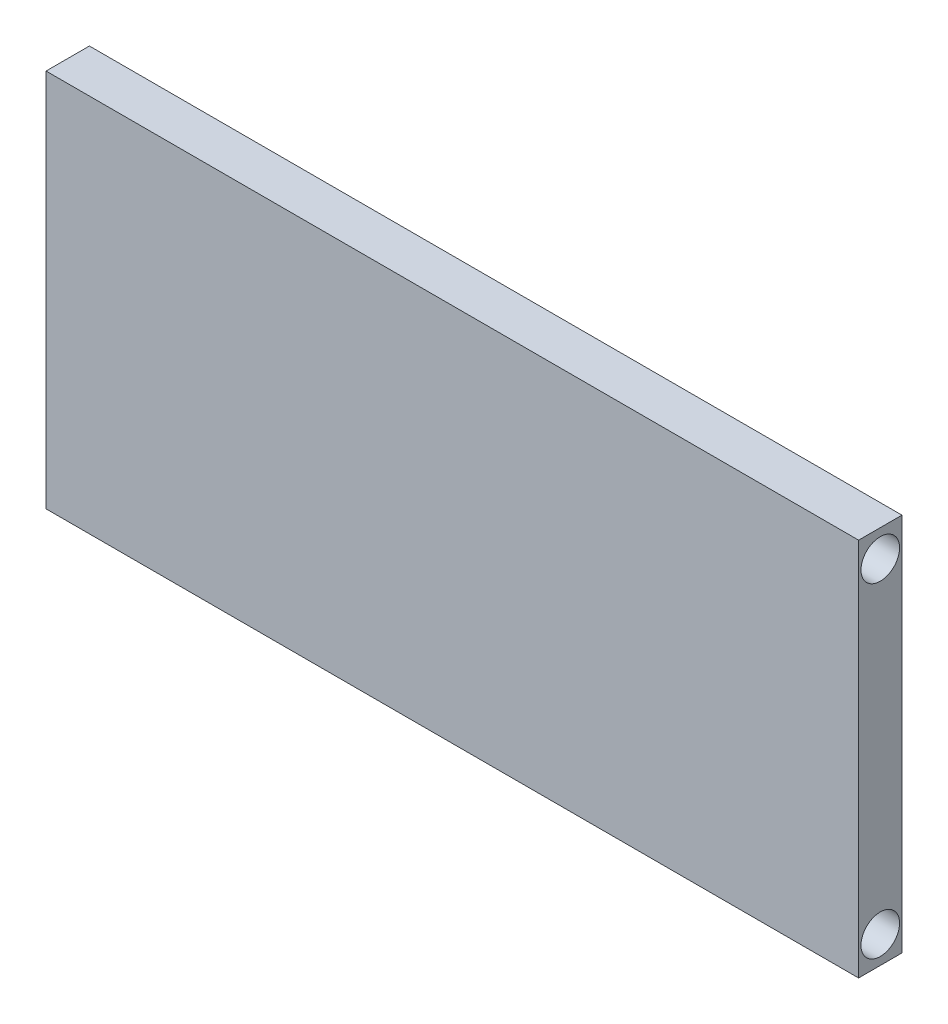
ISO-10303-21;
HEADER;
FILE_DESCRIPTION(('STEP AP214'),'2;1');
FILE_NAME('part.step','',(''),(''),'','','');
FILE_SCHEMA(('AUTOMOTIVE_DESIGN { 1 0 10303 214 1 1 1 1 }'));
ENDSEC;
DATA;
#1=APPLICATION_CONTEXT('core data for automotive mechanical design processes');
#2=APPLICATION_PROTOCOL_DEFINITION('international standard','automotive_design',2000,#1);
#3=PRODUCT_CONTEXT('',#1,'mechanical');
#4=PRODUCT('Part','Part','',(#3));
#5=PRODUCT_RELATED_PRODUCT_CATEGORY('part','',(#4));
#6=PRODUCT_DEFINITION_FORMATION('','',#4);
#7=PRODUCT_DEFINITION_CONTEXT('part definition',#1,'design');
#8=PRODUCT_DEFINITION('design','',#6,#7);
#9=PRODUCT_DEFINITION_SHAPE('','',#8);
#10=(LENGTH_UNIT() NAMED_UNIT(*) SI_UNIT(.MILLI.,.METRE.));
#11=(NAMED_UNIT(*) PLANE_ANGLE_UNIT() SI_UNIT($,.RADIAN.));
#12=(NAMED_UNIT(*) SI_UNIT($,.STERADIAN.) SOLID_ANGLE_UNIT());
#13=UNCERTAINTY_MEASURE_WITH_UNIT(LENGTH_MEASURE(1.E-05),#10,'distance_accuracy_value','');
#14=(GEOMETRIC_REPRESENTATION_CONTEXT(3) GLOBAL_UNCERTAINTY_ASSIGNED_CONTEXT((#13)) GLOBAL_UNIT_ASSIGNED_CONTEXT((#10,
#11,#12)) REPRESENTATION_CONTEXT('',''));
#15=CARTESIAN_POINT('',(0.,0.,0.));
#16=DIRECTION('',(0.,0.,1.));
#17=DIRECTION('',(1.,0.,0.));
#18=AXIS2_PLACEMENT_3D('',#15,#16,#17);
#19=CARTESIAN_POINT('',(-76.2,-35.56,-4.064));
#20=DIRECTION('',(-1.,0.,0.));
#21=DIRECTION('',(0.,0.,1.));
#22=AXIS2_PLACEMENT_3D('',#19,#20,#21);
#23=PLANE('',#22);
#24=CARTESIAN_POINT('',(-76.2,-30.48,0.));
#25=DIRECTION('',(1.,0.,0.));
#26=DIRECTION('',(0.,0.,1.));
#27=AXIS2_PLACEMENT_3D('',#24,#25,#26);
#28=CIRCLE('',#27,3.6195);
#29=CARTESIAN_POINT('',(-76.2,-30.48,-3.6195));
#30=VERTEX_POINT('',#29);
#31=EDGE_CURVE('E132',#30,#30,#28,.T.);
#32=ORIENTED_EDGE('',*,*,#31,.T.);
#33=EDGE_LOOP('',(#32));
#34=FACE_BOUND('',#33,.T.);
#35=CARTESIAN_POINT('',(-76.2,30.48,0.));
#36=DIRECTION('',(1.,0.,0.));
#37=DIRECTION('',(0.,0.,-1.));
#38=AXIS2_PLACEMENT_3D('',#35,#36,#37);
#39=CIRCLE('',#38,3.6195);
#40=CARTESIAN_POINT('',(-76.2,30.48,-3.6195));
#41=VERTEX_POINT('',#40);
#42=EDGE_CURVE('E93',#41,#41,#39,.T.);
#43=ORIENTED_EDGE('',*,*,#42,.T.);
#44=EDGE_LOOP('',(#43));
#45=FACE_BOUND('',#44,.T.);
#46=DIRECTION('',(0.,0.,1.));
#47=VECTOR('',#46,1.);
#48=CARTESIAN_POINT('',(-76.2,-35.56,-4.064));
#49=LINE('',#48,#47);
#50=CARTESIAN_POINT('',(-76.2,-35.56,-4.064));
#51=VERTEX_POINT('',#50);
#52=CARTESIAN_POINT('',(-76.2,-35.56,4.064));
#53=VERTEX_POINT('',#52);
#54=EDGE_CURVE('E38',#51,#53,#49,.T.);
#55=ORIENTED_EDGE('',*,*,#54,.T.);
#56=DIRECTION('',(0.,-1.,0.));
#57=VECTOR('',#56,1.);
#58=CARTESIAN_POINT('',(-76.2,-35.56,4.064));
#59=LINE('',#58,#57);
#60=CARTESIAN_POINT('',(-76.2,35.56,4.064));
#61=VERTEX_POINT('',#60);
#62=EDGE_CURVE('E75',#61,#53,#59,.T.);
#63=ORIENTED_EDGE('',*,*,#62,.F.);
#64=DIRECTION('',(0.,0.,1.));
#65=VECTOR('',#64,1.);
#66=CARTESIAN_POINT('',(-76.2,35.56,-4.064));
#67=LINE('',#66,#65);
#68=CARTESIAN_POINT('',(-76.2,35.56,-4.064));
#69=VERTEX_POINT('',#68);
#70=EDGE_CURVE('E11',#69,#61,#67,.T.);
#71=ORIENTED_EDGE('',*,*,#70,.F.);
#72=DIRECTION('',(0.,-1.,0.));
#73=VECTOR('',#72,1.);
#74=CARTESIAN_POINT('',(-76.2,-35.56,-4.064));
#75=LINE('',#74,#73);
#76=EDGE_CURVE('E76',#69,#51,#75,.T.);
#77=ORIENTED_EDGE('',*,*,#76,.T.);
#78=EDGE_LOOP('',(#55,#63,#71,#77));
#79=FACE_BOUND('',#78,.T.);
#80=ADVANCED_FACE('F35',(#34,#45,#79),#23,.T.);
#81=CARTESIAN_POINT('',(76.2,35.56,-4.064));
#82=DIRECTION('',(0.,1.,0.));
#83=DIRECTION('',(-1.,0.,0.));
#84=AXIS2_PLACEMENT_3D('',#81,#82,#83);
#85=PLANE('',#84);
#86=ORIENTED_EDGE('',*,*,#70,.T.);
#87=DIRECTION('',(-1.,0.,0.));
#88=VECTOR('',#87,1.);
#89=CARTESIAN_POINT('',(76.2,35.56,4.064));
#90=LINE('',#89,#88);
#91=CARTESIAN_POINT('',(76.2,35.56,4.064));
#92=VERTEX_POINT('',#91);
#93=EDGE_CURVE('E92',#92,#61,#90,.T.);
#94=ORIENTED_EDGE('',*,*,#93,.F.);
#95=DIRECTION('',(0.,0.,1.));
#96=VECTOR('',#95,1.);
#97=CARTESIAN_POINT('',(76.2,35.56,-4.064));
#98=LINE('',#97,#96);
#99=CARTESIAN_POINT('',(76.2,35.56,-4.064));
#100=VERTEX_POINT('',#99);
#101=EDGE_CURVE('E43',#100,#92,#98,.T.);
#102=ORIENTED_EDGE('',*,*,#101,.F.);
#103=DIRECTION('',(-1.,0.,0.));
#104=VECTOR('',#103,1.);
#105=CARTESIAN_POINT('',(76.2,35.56,-4.064));
#106=LINE('',#105,#104);
#107=EDGE_CURVE('E81',#100,#69,#106,.T.);
#108=ORIENTED_EDGE('',*,*,#107,.T.);
#109=EDGE_LOOP('',(#86,#94,#102,#108));
#110=FACE_BOUND('',#109,.T.);
#111=ADVANCED_FACE('F112',(#110),#85,.T.);
#112=CARTESIAN_POINT('',(76.2,-35.56,-4.064));
#113=DIRECTION('',(1.,0.,0.));
#114=DIRECTION('',(0.,0.,-1.));
#115=AXIS2_PLACEMENT_3D('',#112,#113,#114);
#116=PLANE('',#115);
#117=CARTESIAN_POINT('',(76.2,-30.48,0.));
#118=DIRECTION('',(1.,0.,0.));
#119=DIRECTION('',(0.,0.,1.));
#120=AXIS2_PLACEMENT_3D('',#117,#118,#119);
#121=CIRCLE('',#120,3.6195);
#122=CARTESIAN_POINT('',(76.2,-30.48,-3.6195));
#123=VERTEX_POINT('',#122);
#124=EDGE_CURVE('E142',#123,#123,#121,.T.);
#125=ORIENTED_EDGE('',*,*,#124,.F.);
#126=EDGE_LOOP('',(#125));
#127=FACE_BOUND('',#126,.T.);
#128=CARTESIAN_POINT('',(76.2,30.48,0.));
#129=DIRECTION('',(1.,0.,0.));
#130=DIRECTION('',(0.,0.,-1.));
#131=AXIS2_PLACEMENT_3D('',#128,#129,#130);
#132=CIRCLE('',#131,3.6195);
#133=CARTESIAN_POINT('',(76.2,30.48,-3.6195));
#134=VERTEX_POINT('',#133);
#135=EDGE_CURVE('E96',#134,#134,#132,.T.);
#136=ORIENTED_EDGE('',*,*,#135,.F.);
#137=EDGE_LOOP('',(#136));
#138=FACE_BOUND('',#137,.T.);
#139=ORIENTED_EDGE('',*,*,#101,.T.);
#140=DIRECTION('',(0.,1.,0.));
#141=VECTOR('',#140,1.);
#142=CARTESIAN_POINT('',(76.2,-35.56,4.064));
#143=LINE('',#142,#141);
#144=CARTESIAN_POINT('',(76.2,-35.56,4.064));
#145=VERTEX_POINT('',#144);
#146=EDGE_CURVE('E88',#145,#92,#143,.T.);
#147=ORIENTED_EDGE('',*,*,#146,.F.);
#148=DIRECTION('',(0.,0.,1.));
#149=VECTOR('',#148,1.);
#150=CARTESIAN_POINT('',(76.2,-35.56,-4.064));
#151=LINE('',#150,#149);
#152=CARTESIAN_POINT('',(76.2,-35.56,-4.064));
#153=VERTEX_POINT('',#152);
#154=EDGE_CURVE('E80',#153,#145,#151,.T.);
#155=ORIENTED_EDGE('',*,*,#154,.F.);
#156=DIRECTION('',(0.,1.,0.));
#157=VECTOR('',#156,1.);
#158=CARTESIAN_POINT('',(76.2,-35.56,-4.064));
#159=LINE('',#158,#157);
#160=EDGE_CURVE('E105',#153,#100,#159,.T.);
#161=ORIENTED_EDGE('',*,*,#160,.T.);
#162=EDGE_LOOP('',(#139,#147,#155,#161));
#163=FACE_BOUND('',#162,.T.);
#164=ADVANCED_FACE('F109',(#127,#138,#163),#116,.T.);
#165=CARTESIAN_POINT('',(76.2,-35.56,-4.064));
#166=DIRECTION('',(0.,-1.,0.));
#167=DIRECTION('',(1.,0.,0.));
#168=AXIS2_PLACEMENT_3D('',#165,#166,#167);
#169=PLANE('',#168);
#170=ORIENTED_EDGE('',*,*,#154,.T.);
#171=DIRECTION('',(1.,0.,0.));
#172=VECTOR('',#171,1.);
#173=CARTESIAN_POINT('',(76.2,-35.56,4.064));
#174=LINE('',#173,#172);
#175=EDGE_CURVE('E83',#53,#145,#174,.T.);
#176=ORIENTED_EDGE('',*,*,#175,.F.);
#177=ORIENTED_EDGE('',*,*,#54,.F.);
#178=DIRECTION('',(1.,0.,0.));
#179=VECTOR('',#178,1.);
#180=CARTESIAN_POINT('',(76.2,-35.56,-4.064));
#181=LINE('',#180,#179);
#182=EDGE_CURVE('E103',#51,#153,#181,.T.);
#183=ORIENTED_EDGE('',*,*,#182,.T.);
#184=EDGE_LOOP('',(#170,#176,#177,#183));
#185=FACE_BOUND('',#184,.T.);
#186=ADVANCED_FACE('F84',(#185),#169,.T.);
#187=CARTESIAN_POINT('',(0.,0.,-4.064));
#188=DIRECTION('',(0.,0.,1.));
#189=DIRECTION('',(1.,0.,0.));
#190=AXIS2_PLACEMENT_3D('',#187,#188,#189);
#191=PLANE('',#190);
#192=ORIENTED_EDGE('',*,*,#76,.F.);
#193=ORIENTED_EDGE('',*,*,#107,.F.);
#194=ORIENTED_EDGE('',*,*,#160,.F.);
#195=ORIENTED_EDGE('',*,*,#182,.F.);
#196=EDGE_LOOP('',(#192,#193,#194,#195));
#197=FACE_BOUND('',#196,.T.);
#198=ADVANCED_FACE('F114',(#197),#191,.F.);
#199=CARTESIAN_POINT('',(0.,0.,4.064));
#200=DIRECTION('',(0.,0.,1.));
#201=DIRECTION('',(1.,0.,0.));
#202=AXIS2_PLACEMENT_3D('',#199,#200,#201);
#203=PLANE('',#202);
#204=ORIENTED_EDGE('',*,*,#62,.T.);
#205=ORIENTED_EDGE('',*,*,#175,.T.);
#206=ORIENTED_EDGE('',*,*,#146,.T.);
#207=ORIENTED_EDGE('',*,*,#93,.T.);
#208=EDGE_LOOP('',(#204,#205,#206,#207));
#209=FACE_BOUND('',#208,.T.);
#210=ADVANCED_FACE('F91',(#209),#203,.T.);
#211=CARTESIAN_POINT('',(-76.2,30.48,0.));
#212=DIRECTION('',(1.,0.,0.));
#213=DIRECTION('',(0.,0.,-1.));
#214=AXIS2_PLACEMENT_3D('',#211,#212,#213);
#215=CYLINDRICAL_SURFACE('',#214,3.6195);
#216=CARTESIAN_POINT('',(-76.2,30.48,-3.6195));
#217=CARTESIAN_POINT('',(-74.6125,30.48,-3.6195));
#218=CARTESIAN_POINT('',(-73.025,30.48,-3.6195));
#219=CARTESIAN_POINT('',(-69.85,30.48,-3.6195));
#220=CARTESIAN_POINT('',(-68.2625,30.48,-3.6195));
#221=CARTESIAN_POINT('',(-65.0875,30.48,-3.6195));
#222=CARTESIAN_POINT('',(-63.5,30.48,-3.6195));
#223=CARTESIAN_POINT('',(-60.325,30.48,-3.6195));
#224=CARTESIAN_POINT('',(-58.7375,30.48,-3.6195));
#225=CARTESIAN_POINT('',(-55.5625,30.48,-3.6195));
#226=CARTESIAN_POINT('',(-53.975,30.48,-3.6195));
#227=CARTESIAN_POINT('',(-50.8,30.48,-3.6195));
#228=CARTESIAN_POINT('',(-49.2125,30.48,-3.6195));
#229=CARTESIAN_POINT('',(-46.0375,30.48,-3.6195));
#230=CARTESIAN_POINT('',(-44.45,30.48,-3.6195));
#231=CARTESIAN_POINT('',(-41.275,30.48,-3.6195));
#232=CARTESIAN_POINT('',(-39.6875,30.48,-3.6195));
#233=CARTESIAN_POINT('',(-36.5125,30.48,-3.6195));
#234=CARTESIAN_POINT('',(-34.925,30.48,-3.6195));
#235=CARTESIAN_POINT('',(-31.75,30.48,-3.6195));
#236=CARTESIAN_POINT('',(-30.1625,30.48,-3.6195));
#237=CARTESIAN_POINT('',(-26.9875,30.48,-3.6195));
#238=CARTESIAN_POINT('',(-25.4,30.48,-3.6195));
#239=CARTESIAN_POINT('',(-22.225,30.48,-3.6195));
#240=CARTESIAN_POINT('',(-20.6375,30.48,-3.6195));
#241=CARTESIAN_POINT('',(-17.4625,30.48,-3.6195));
#242=CARTESIAN_POINT('',(-15.875,30.48,-3.6195));
#243=CARTESIAN_POINT('',(-12.7,30.48,-3.6195));
#244=CARTESIAN_POINT('',(-11.1125,30.48,-3.6195));
#245=CARTESIAN_POINT('',(-7.93750000000003,30.48,-3.6195));
#246=CARTESIAN_POINT('',(-6.35000000000003,30.48,-3.6195));
#247=CARTESIAN_POINT('',(-3.17500000000003,30.48,-3.6195));
#248=CARTESIAN_POINT('',(-1.58750000000003,30.48,-3.6195));
#249=CARTESIAN_POINT('',(1.58749999999997,30.48,-3.6195));
#250=CARTESIAN_POINT('',(3.17499999999997,30.48,-3.6195));
#251=CARTESIAN_POINT('',(6.34999999999998,30.48,-3.6195));
#252=CARTESIAN_POINT('',(7.93749999999998,30.48,-3.6195));
#253=CARTESIAN_POINT('',(11.1125,30.48,-3.6195));
#254=CARTESIAN_POINT('',(12.7,30.48,-3.6195));
#255=CARTESIAN_POINT('',(15.875,30.48,-3.6195));
#256=CARTESIAN_POINT('',(17.4625,30.48,-3.6195));
#257=CARTESIAN_POINT('',(20.6375,30.48,-3.6195));
#258=CARTESIAN_POINT('',(22.225,30.48,-3.6195));
#259=CARTESIAN_POINT('',(25.4,30.48,-3.6195));
#260=CARTESIAN_POINT('',(26.9875,30.48,-3.6195));
#261=CARTESIAN_POINT('',(30.1625,30.48,-3.6195));
#262=CARTESIAN_POINT('',(31.75,30.48,-3.6195));
#263=CARTESIAN_POINT('',(34.925,30.48,-3.6195));
#264=CARTESIAN_POINT('',(36.5125,30.48,-3.6195));
#265=CARTESIAN_POINT('',(39.6875,30.48,-3.6195));
#266=CARTESIAN_POINT('',(41.275,30.48,-3.6195));
#267=CARTESIAN_POINT('',(44.45,30.48,-3.6195));
#268=CARTESIAN_POINT('',(46.0375,30.48,-3.6195));
#269=CARTESIAN_POINT('',(49.2125,30.48,-3.6195));
#270=CARTESIAN_POINT('',(50.8,30.48,-3.6195));
#271=CARTESIAN_POINT('',(53.975,30.48,-3.6195));
#272=CARTESIAN_POINT('',(55.5625,30.48,-3.6195));
#273=CARTESIAN_POINT('',(58.7375,30.48,-3.6195));
#274=CARTESIAN_POINT('',(60.325,30.48,-3.6195));
#275=CARTESIAN_POINT('',(63.5,30.48,-3.6195));
#276=CARTESIAN_POINT('',(65.0875,30.48,-3.6195));
#277=CARTESIAN_POINT('',(68.2625,30.48,-3.6195));
#278=CARTESIAN_POINT('',(69.85,30.48,-3.6195));
#279=CARTESIAN_POINT('',(73.025,30.48,-3.6195));
#280=CARTESIAN_POINT('',(74.6125,30.48,-3.6195));
#281=CARTESIAN_POINT('',(76.2,30.48,-3.6195));
#282=B_SPLINE_CURVE_WITH_KNOTS('',3,(#216,#217,#218,#219,#220,#221,#222,#223,#224,#225,#226,
#227,#228,#229,#230,#231,#232,#233,#234,#235,#236,#237,#238,#239,#240,#241,#242,#243,#244,#245,
#246,#247,#248,#249,#250,#251,#252,#253,#254,#255,#256,#257,#258,#259,#260,#261,#262,#263,#264,
#265,#266,#267,#268,#269,#270,#271,#272,#273,#274,#275,#276,#277,#278,#279,#280,#281),
.UNSPECIFIED.,.F.,.F.,(4,2,2,2,2,2,2,2,2,2,2,2,2,2,2,2,2,2,2,2,2,2,2,2,2,2,2,2,2,2,2,2,4),(0.,
4.7625,9.52500000000001,14.2875,19.05,23.8125,28.575,33.3375,38.1,42.8625,47.625,52.3875,57.15,
61.9125,66.675,71.4375,76.2,80.9625,85.725,90.4875,95.25,100.0125,104.775,109.5375,114.3,
119.0625,123.825,128.5875,133.35,138.1125,142.875,147.6375,152.4),.UNSPECIFIED.);
#283=EDGE_CURVE('BSEAM121',#41,#134,#282,.T.);
#284=ORIENTED_EDGE('',*,*,#42,.F.);
#285=ORIENTED_EDGE('',*,*,#135,.T.);
#286=ORIENTED_EDGE('',*,*,#283,.T.);
#287=ORIENTED_EDGE('',*,*,#283,.F.);
#288=EDGE_LOOP('',(#284,#286,#285,#287));
#289=FACE_BOUND('',#288,.T.);
#290=ADVANCED_FACE('F121',(#289),#215,.F.);
#291=CARTESIAN_POINT('',(-76.2,-30.48,0.));
#292=DIRECTION('',(1.,0.,0.));
#293=DIRECTION('',(0.,0.,-1.));
#294=AXIS2_PLACEMENT_3D('',#291,#292,#293);
#295=CYLINDRICAL_SURFACE('',#294,3.6195);
#296=CARTESIAN_POINT('',(-76.2,-30.48,-3.6195));
#297=CARTESIAN_POINT('',(-74.6125,-30.48,-3.6195));
#298=CARTESIAN_POINT('',(-73.025,-30.48,-3.6195));
#299=CARTESIAN_POINT('',(-69.85,-30.48,-3.6195));
#300=CARTESIAN_POINT('',(-68.2625,-30.48,-3.6195));
#301=CARTESIAN_POINT('',(-65.0875,-30.48,-3.6195));
#302=CARTESIAN_POINT('',(-63.5,-30.48,-3.6195));
#303=CARTESIAN_POINT('',(-60.325,-30.48,-3.6195));
#304=CARTESIAN_POINT('',(-58.7375,-30.48,-3.6195));
#305=CARTESIAN_POINT('',(-55.5625,-30.48,-3.6195));
#306=CARTESIAN_POINT('',(-53.975,-30.48,-3.6195));
#307=CARTESIAN_POINT('',(-50.8,-30.48,-3.6195));
#308=CARTESIAN_POINT('',(-49.2125,-30.48,-3.6195));
#309=CARTESIAN_POINT('',(-46.0375,-30.48,-3.6195));
#310=CARTESIAN_POINT('',(-44.45,-30.48,-3.6195));
#311=CARTESIAN_POINT('',(-41.275,-30.48,-3.6195));
#312=CARTESIAN_POINT('',(-39.6875,-30.48,-3.6195));
#313=CARTESIAN_POINT('',(-36.5125,-30.48,-3.6195));
#314=CARTESIAN_POINT('',(-34.925,-30.48,-3.6195));
#315=CARTESIAN_POINT('',(-31.75,-30.48,-3.6195));
#316=CARTESIAN_POINT('',(-30.1625,-30.48,-3.6195));
#317=CARTESIAN_POINT('',(-26.9875,-30.48,-3.6195));
#318=CARTESIAN_POINT('',(-25.4,-30.48,-3.6195));
#319=CARTESIAN_POINT('',(-22.225,-30.48,-3.6195));
#320=CARTESIAN_POINT('',(-20.6375,-30.48,-3.6195));
#321=CARTESIAN_POINT('',(-17.4625,-30.48,-3.6195));
#322=CARTESIAN_POINT('',(-15.875,-30.48,-3.6195));
#323=CARTESIAN_POINT('',(-12.7,-30.48,-3.6195));
#324=CARTESIAN_POINT('',(-11.1125,-30.48,-3.6195));
#325=CARTESIAN_POINT('',(-7.93750000000003,-30.48,-3.6195));
#326=CARTESIAN_POINT('',(-6.35000000000003,-30.48,-3.6195));
#327=CARTESIAN_POINT('',(-3.17500000000003,-30.48,-3.6195));
#328=CARTESIAN_POINT('',(-1.58750000000003,-30.48,-3.6195));
#329=CARTESIAN_POINT('',(1.58749999999997,-30.48,-3.6195));
#330=CARTESIAN_POINT('',(3.17499999999997,-30.48,-3.6195));
#331=CARTESIAN_POINT('',(6.34999999999998,-30.48,-3.6195));
#332=CARTESIAN_POINT('',(7.93749999999998,-30.48,-3.6195));
#333=CARTESIAN_POINT('',(11.1125,-30.48,-3.6195));
#334=CARTESIAN_POINT('',(12.7,-30.48,-3.6195));
#335=CARTESIAN_POINT('',(15.875,-30.48,-3.6195));
#336=CARTESIAN_POINT('',(17.4625,-30.48,-3.6195));
#337=CARTESIAN_POINT('',(20.6375,-30.48,-3.6195));
#338=CARTESIAN_POINT('',(22.225,-30.48,-3.6195));
#339=CARTESIAN_POINT('',(25.4,-30.48,-3.6195));
#340=CARTESIAN_POINT('',(26.9875,-30.48,-3.6195));
#341=CARTESIAN_POINT('',(30.1625,-30.48,-3.6195));
#342=CARTESIAN_POINT('',(31.75,-30.48,-3.6195));
#343=CARTESIAN_POINT('',(34.925,-30.48,-3.6195));
#344=CARTESIAN_POINT('',(36.5125,-30.48,-3.6195));
#345=CARTESIAN_POINT('',(39.6875,-30.48,-3.6195));
#346=CARTESIAN_POINT('',(41.275,-30.48,-3.6195));
#347=CARTESIAN_POINT('',(44.45,-30.48,-3.6195));
#348=CARTESIAN_POINT('',(46.0375,-30.48,-3.6195));
#349=CARTESIAN_POINT('',(49.2125,-30.48,-3.6195));
#350=CARTESIAN_POINT('',(50.8,-30.48,-3.6195));
#351=CARTESIAN_POINT('',(53.975,-30.48,-3.6195));
#352=CARTESIAN_POINT('',(55.5625,-30.48,-3.6195));
#353=CARTESIAN_POINT('',(58.7375,-30.48,-3.6195));
#354=CARTESIAN_POINT('',(60.325,-30.48,-3.6195));
#355=CARTESIAN_POINT('',(63.5,-30.48,-3.6195));
#356=CARTESIAN_POINT('',(65.0875,-30.48,-3.6195));
#357=CARTESIAN_POINT('',(68.2625,-30.48,-3.6195));
#358=CARTESIAN_POINT('',(69.85,-30.48,-3.6195));
#359=CARTESIAN_POINT('',(73.025,-30.48,-3.6195));
#360=CARTESIAN_POINT('',(74.6125,-30.48,-3.6195));
#361=CARTESIAN_POINT('',(76.2,-30.48,-3.6195));
#362=B_SPLINE_CURVE_WITH_KNOTS('',3,(#296,#297,#298,#299,#300,#301,#302,#303,#304,#305,#306,
#307,#308,#309,#310,#311,#312,#313,#314,#315,#316,#317,#318,#319,#320,#321,#322,#323,#324,#325,
#326,#327,#328,#329,#330,#331,#332,#333,#334,#335,#336,#337,#338,#339,#340,#341,#342,#343,#344,
#345,#346,#347,#348,#349,#350,#351,#352,#353,#354,#355,#356,#357,#358,#359,#360,#361),
.UNSPECIFIED.,.F.,.F.,(4,2,2,2,2,2,2,2,2,2,2,2,2,2,2,2,2,2,2,2,2,2,2,2,2,2,2,2,2,2,2,2,4),(0.,
4.7625,9.52500000000001,14.2875,19.05,23.8125,28.575,33.3375,38.1,42.8625,47.625,52.3875,57.15,
61.9125,66.675,71.4375,76.2,80.9625,85.725,90.4875,95.25,100.0125,104.775,109.5375,114.3,
119.0625,123.825,128.5875,133.35,138.1125,142.875,147.6375,152.4),.UNSPECIFIED.);
#363=EDGE_CURVE('BSEAM137',#30,#123,#362,.T.);
#364=ORIENTED_EDGE('',*,*,#31,.F.);
#365=ORIENTED_EDGE('',*,*,#124,.T.);
#366=ORIENTED_EDGE('',*,*,#363,.T.);
#367=ORIENTED_EDGE('',*,*,#363,.F.);
#368=EDGE_LOOP('',(#364,#366,#365,#367));
#369=FACE_BOUND('',#368,.T.);
#370=ADVANCED_FACE('F137',(#369),#295,.F.);
#371=CLOSED_SHELL('',(#80,#111,#164,#186,#198,#210,#290,#370));
#372=MANIFOLD_SOLID_BREP('B2',#371);
#373=ADVANCED_BREP_SHAPE_REPRESENTATION('',(#18,#372),#14);
#374=SHAPE_DEFINITION_REPRESENTATION(#9,#373);
ENDSEC;
END-ISO-10303-21;
